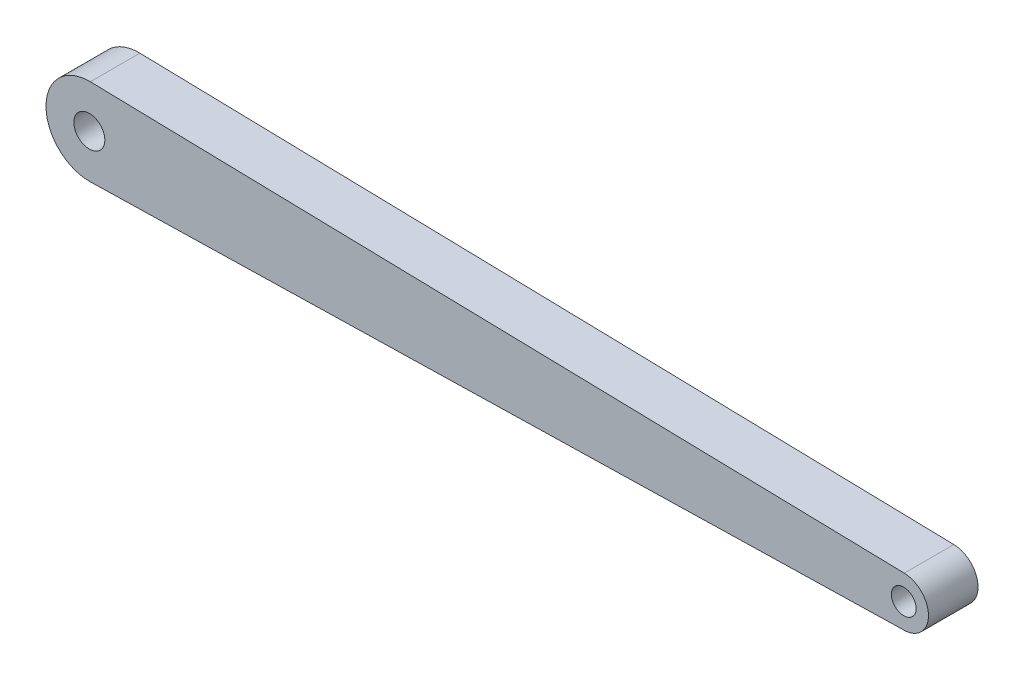
ISO-10303-21;
HEADER;
FILE_DESCRIPTION(('STEP AP214'),'2;1');
FILE_NAME('part.step','',(''),(''),'','','');
FILE_SCHEMA(('AUTOMOTIVE_DESIGN { 1 0 10303 214 1 1 1 1 }'));
ENDSEC;
DATA;
#1=APPLICATION_CONTEXT('core data for automotive mechanical design processes');
#2=APPLICATION_PROTOCOL_DEFINITION('international standard','automotive_design',2000,#1);
#3=PRODUCT_CONTEXT('',#1,'mechanical');
#4=PRODUCT('Part','Part','',(#3));
#5=PRODUCT_RELATED_PRODUCT_CATEGORY('part','',(#4));
#6=PRODUCT_DEFINITION_FORMATION('','',#4);
#7=PRODUCT_DEFINITION_CONTEXT('part definition',#1,'design');
#8=PRODUCT_DEFINITION('design','',#6,#7);
#9=PRODUCT_DEFINITION_SHAPE('','',#8);
#10=(LENGTH_UNIT() NAMED_UNIT(*) SI_UNIT(.MILLI.,.METRE.));
#11=(NAMED_UNIT(*) PLANE_ANGLE_UNIT() SI_UNIT($,.RADIAN.));
#12=(NAMED_UNIT(*) SI_UNIT($,.STERADIAN.) SOLID_ANGLE_UNIT());
#13=UNCERTAINTY_MEASURE_WITH_UNIT(LENGTH_MEASURE(1.E-05),#10,'distance_accuracy_value','');
#14=(GEOMETRIC_REPRESENTATION_CONTEXT(3) GLOBAL_UNCERTAINTY_ASSIGNED_CONTEXT((#13)) GLOBAL_UNIT_ASSIGNED_CONTEXT((#10,
#11,#12)) REPRESENTATION_CONTEXT('',''));
#15=CARTESIAN_POINT('',(0.,0.,0.));
#16=DIRECTION('',(0.,0.,1.));
#17=DIRECTION('',(1.,0.,0.));
#18=AXIS2_PLACEMENT_3D('',#15,#16,#17);
#19=CARTESIAN_POINT('',(-1315.,0.,40.));
#20=DIRECTION('',(0.,0.,1.));
#21=DIRECTION('',(1.,0.,0.));
#22=AXIS2_PLACEMENT_3D('',#19,#20,#21);
#23=PLANE('',#22);
#24=CARTESIAN_POINT('',(0.,0.,40.));
#25=DIRECTION('',(0.,0.,1.));
#26=DIRECTION('',(1.,0.,0.));
#27=AXIS2_PLACEMENT_3D('',#24,#25,#26);
#28=CIRCLE('',#27,20.);
#29=CARTESIAN_POINT('',(20.,0.,40.));
#30=VERTEX_POINT('',#29);
#31=EDGE_CURVE('E112',#30,#30,#28,.T.);
#32=ORIENTED_EDGE('',*,*,#31,.F.);
#33=EDGE_LOOP('',(#32));
#34=FACE_BOUND('',#33,.T.);
#35=CARTESIAN_POINT('',(-1315.,0.,40.));
#36=DIRECTION('',(0.,0.,1.));
#37=DIRECTION('',(1.,0.,0.));
#38=AXIS2_PLACEMENT_3D('',#35,#36,#37);
#39=CIRCLE('',#38,70.);
#40=CARTESIAN_POINT('',(-1313.40304182509,69.9817813762097,40.));
#41=VERTEX_POINT('',#40);
#42=CARTESIAN_POINT('',(-1313.40304182509,-69.9817813762097,40.));
#43=VERTEX_POINT('',#42);
#44=EDGE_CURVE('E92',#41,#43,#39,.T.);
#45=ORIENTED_EDGE('',*,*,#44,.T.);
#46=DIRECTION('',(0.999739733945852,0.0228136882129278,0.));
#47=VECTOR('',#46,1.);
#48=CARTESIAN_POINT('',(-1313.40304182509,-69.9817813762097,40.));
#49=LINE('',#48,#47);
#50=CARTESIAN_POINT('',(0.912547528517138,-39.9895893578341,40.));
#51=VERTEX_POINT('',#50);
#52=EDGE_CURVE('E87',#43,#51,#49,.T.);
#53=ORIENTED_EDGE('',*,*,#52,.T.);
#54=CARTESIAN_POINT('',(0.,0.,40.));
#55=DIRECTION('',(0.,0.,1.));
#56=DIRECTION('',(-1.,0.,0.));
#57=AXIS2_PLACEMENT_3D('',#54,#55,#56);
#58=CIRCLE('',#57,40.);
#59=CARTESIAN_POINT('',(0.912547528517111,39.9895893578341,40.));
#60=VERTEX_POINT('',#59);
#61=EDGE_CURVE('E90',#51,#60,#58,.T.);
#62=ORIENTED_EDGE('',*,*,#61,.T.);
#63=DIRECTION('',(-0.999739733945852,0.0228136882129278,0.));
#64=VECTOR('',#63,1.);
#65=CARTESIAN_POINT('',(-1313.40304182509,69.9817813762097,40.));
#66=LINE('',#65,#64);
#67=EDGE_CURVE('E57',#60,#41,#66,.T.);
#68=ORIENTED_EDGE('',*,*,#67,.T.);
#69=EDGE_LOOP('',(#45,#53,#62,#68));
#70=FACE_BOUND('',#69,.T.);
#71=CARTESIAN_POINT('',(-1315.,0.,40.));
#72=DIRECTION('',(0.,0.,1.));
#73=DIRECTION('',(1.,0.,0.));
#74=AXIS2_PLACEMENT_3D('',#71,#72,#73);
#75=CIRCLE('',#74,25.);
#76=CARTESIAN_POINT('',(-1290.,0.,40.));
#77=VERTEX_POINT('',#76);
#78=EDGE_CURVE('E134',#77,#77,#75,.T.);
#79=ORIENTED_EDGE('',*,*,#78,.F.);
#80=EDGE_LOOP('',(#79));
#81=FACE_BOUND('',#80,.T.);
#82=ADVANCED_FACE('F39',(#34,#70,#81),#23,.T.);
#83=CARTESIAN_POINT('',(-1315.,0.,-40.));
#84=DIRECTION('',(0.,0.,1.));
#85=DIRECTION('',(1.,0.,0.));
#86=AXIS2_PLACEMENT_3D('',#83,#84,#85);
#87=PLANE('',#86);
#88=CARTESIAN_POINT('',(-1315.,0.,-40.));
#89=DIRECTION('',(0.,0.,1.));
#90=DIRECTION('',(1.,0.,0.));
#91=AXIS2_PLACEMENT_3D('',#88,#89,#90);
#92=CIRCLE('',#91,70.);
#93=CARTESIAN_POINT('',(-1313.40304182509,69.9817813762097,-40.));
#94=VERTEX_POINT('',#93);
#95=CARTESIAN_POINT('',(-1313.40304182509,-69.9817813762097,-40.));
#96=VERTEX_POINT('',#95);
#97=EDGE_CURVE('E108',#94,#96,#92,.T.);
#98=ORIENTED_EDGE('',*,*,#97,.F.);
#99=DIRECTION('',(-0.999739733945852,0.0228136882129278,0.));
#100=VECTOR('',#99,1.);
#101=CARTESIAN_POINT('',(-1313.40304182509,69.9817813762097,-40.));
#102=LINE('',#101,#100);
#103=CARTESIAN_POINT('',(0.912547528517111,39.9895893578341,-40.));
#104=VERTEX_POINT('',#103);
#105=EDGE_CURVE('E80',#104,#94,#102,.T.);
#106=ORIENTED_EDGE('',*,*,#105,.F.);
#107=CARTESIAN_POINT('',(0.,0.,-40.));
#108=DIRECTION('',(0.,0.,1.));
#109=DIRECTION('',(-1.,0.,0.));
#110=AXIS2_PLACEMENT_3D('',#107,#108,#109);
#111=CIRCLE('',#110,40.);
#112=CARTESIAN_POINT('',(0.912547528517138,-39.9895893578341,-40.));
#113=VERTEX_POINT('',#112);
#114=EDGE_CURVE('E74',#113,#104,#111,.T.);
#115=ORIENTED_EDGE('',*,*,#114,.F.);
#116=DIRECTION('',(0.999739733945852,0.0228136882129278,0.));
#117=VECTOR('',#116,1.);
#118=CARTESIAN_POINT('',(-1313.40304182509,-69.9817813762097,-40.));
#119=LINE('',#118,#117);
#120=EDGE_CURVE('E97',#96,#113,#119,.T.);
#121=ORIENTED_EDGE('',*,*,#120,.F.);
#122=EDGE_LOOP('',(#98,#106,#115,#121));
#123=FACE_BOUND('',#122,.T.);
#124=CARTESIAN_POINT('',(0.,0.,-40.));
#125=DIRECTION('',(0.,0.,1.));
#126=DIRECTION('',(1.,0.,0.));
#127=AXIS2_PLACEMENT_3D('',#124,#125,#126);
#128=CIRCLE('',#127,20.);
#129=CARTESIAN_POINT('',(20.,0.,-40.));
#130=VERTEX_POINT('',#129);
#131=EDGE_CURVE('E130',#130,#130,#128,.T.);
#132=ORIENTED_EDGE('',*,*,#131,.T.);
#133=EDGE_LOOP('',(#132));
#134=FACE_BOUND('',#133,.T.);
#135=CARTESIAN_POINT('',(-1315.,0.,-40.));
#136=DIRECTION('',(0.,0.,1.));
#137=DIRECTION('',(1.,0.,0.));
#138=AXIS2_PLACEMENT_3D('',#135,#136,#137);
#139=CIRCLE('',#138,25.);
#140=CARTESIAN_POINT('',(-1290.,0.,-40.));
#141=VERTEX_POINT('',#140);
#142=EDGE_CURVE('E138',#141,#141,#139,.T.);
#143=ORIENTED_EDGE('',*,*,#142,.T.);
#144=EDGE_LOOP('',(#143));
#145=FACE_BOUND('',#144,.T.);
#146=ADVANCED_FACE('F125',(#123,#134,#145),#87,.F.);
#147=CARTESIAN_POINT('',(-1315.,0.,40.));
#148=DIRECTION('',(0.,0.,-1.));
#149=DIRECTION('',(-1.,0.,0.));
#150=AXIS2_PLACEMENT_3D('',#147,#148,#149);
#151=CYLINDRICAL_SURFACE('',#150,70.);
#152=ORIENTED_EDGE('',*,*,#97,.T.);
#153=DIRECTION('',(0.,0.,-1.));
#154=VECTOR('',#153,1.);
#155=CARTESIAN_POINT('',(-1313.40304182509,-69.9817813762097,40.));
#156=LINE('',#155,#154);
#157=EDGE_CURVE('E11',#43,#96,#156,.T.);
#158=ORIENTED_EDGE('',*,*,#157,.F.);
#159=ORIENTED_EDGE('',*,*,#44,.F.);
#160=DIRECTION('',(0.,0.,-1.));
#161=VECTOR('',#160,1.);
#162=CARTESIAN_POINT('',(-1313.40304182509,69.9817813762097,40.));
#163=LINE('',#162,#161);
#164=EDGE_CURVE('E104',#41,#94,#163,.T.);
#165=ORIENTED_EDGE('',*,*,#164,.T.);
#166=EDGE_LOOP('',(#152,#158,#159,#165));
#167=FACE_BOUND('',#166,.T.);
#168=ADVANCED_FACE('F41',(#167),#151,.T.);
#169=CARTESIAN_POINT('',(-1313.40304182509,-69.9817813762097,40.));
#170=DIRECTION('',(-0.0228136882129278,0.999739733945852,0.));
#171=DIRECTION('',(-0.999739733945852,-0.0228136882129278,0.));
#172=AXIS2_PLACEMENT_3D('',#169,#170,#171);
#173=PLANE('',#172);
#174=ORIENTED_EDGE('',*,*,#120,.T.);
#175=DIRECTION('',(0.,0.,-1.));
#176=VECTOR('',#175,1.);
#177=CARTESIAN_POINT('',(0.912547528517138,-39.9895893578341,40.));
#178=LINE('',#177,#176);
#179=EDGE_CURVE('E49',#51,#113,#178,.T.);
#180=ORIENTED_EDGE('',*,*,#179,.F.);
#181=ORIENTED_EDGE('',*,*,#52,.F.);
#182=ORIENTED_EDGE('',*,*,#157,.T.);
#183=EDGE_LOOP('',(#174,#180,#181,#182));
#184=FACE_BOUND('',#183,.T.);
#185=ADVANCED_FACE('F96',(#184),#173,.F.);
#186=CARTESIAN_POINT('',(0.,0.,40.));
#187=DIRECTION('',(0.,0.,-1.));
#188=DIRECTION('',(-1.,0.,0.));
#189=AXIS2_PLACEMENT_3D('',#186,#187,#188);
#190=CYLINDRICAL_SURFACE('',#189,40.);
#191=ORIENTED_EDGE('',*,*,#114,.T.);
#192=DIRECTION('',(0.,0.,-1.));
#193=VECTOR('',#192,1.);
#194=CARTESIAN_POINT('',(0.912547528517111,39.9895893578341,40.));
#195=LINE('',#194,#193);
#196=EDGE_CURVE('E99',#60,#104,#195,.T.);
#197=ORIENTED_EDGE('',*,*,#196,.F.);
#198=ORIENTED_EDGE('',*,*,#61,.F.);
#199=ORIENTED_EDGE('',*,*,#179,.T.);
#200=EDGE_LOOP('',(#191,#197,#198,#199));
#201=FACE_BOUND('',#200,.T.);
#202=ADVANCED_FACE('F100',(#201),#190,.T.);
#203=CARTESIAN_POINT('',(-1313.40304182509,69.9817813762097,40.));
#204=DIRECTION('',(-0.0228136882129278,-0.999739733945852,0.));
#205=DIRECTION('',(0.999739733945852,-0.0228136882129278,0.));
#206=AXIS2_PLACEMENT_3D('',#203,#204,#205);
#207=PLANE('',#206);
#208=ORIENTED_EDGE('',*,*,#105,.T.);
#209=ORIENTED_EDGE('',*,*,#164,.F.);
#210=ORIENTED_EDGE('',*,*,#67,.F.);
#211=ORIENTED_EDGE('',*,*,#196,.T.);
#212=EDGE_LOOP('',(#208,#209,#210,#211));
#213=FACE_BOUND('',#212,.T.);
#214=ADVANCED_FACE('F122',(#213),#207,.F.);
#215=CARTESIAN_POINT('',(0.,0.,40.));
#216=DIRECTION('',(0.,0.,-1.));
#217=DIRECTION('',(-1.,0.,0.));
#218=AXIS2_PLACEMENT_3D('',#215,#216,#217);
#219=CYLINDRICAL_SURFACE('',#218,20.);
#220=ORIENTED_EDGE('',*,*,#31,.T.);
#221=EDGE_LOOP('',(#220));
#222=FACE_BOUND('',#221,.T.);
#223=ORIENTED_EDGE('',*,*,#131,.F.);
#224=EDGE_LOOP('',(#223));
#225=FACE_BOUND('',#224,.T.);
#226=ADVANCED_FACE('F157',(#222,#225),#219,.F.);
#227=CARTESIAN_POINT('',(-1315.,0.,40.));
#228=DIRECTION('',(0.,0.,-1.));
#229=DIRECTION('',(-1.,0.,0.));
#230=AXIS2_PLACEMENT_3D('',#227,#228,#229);
#231=CYLINDRICAL_SURFACE('',#230,25.);
#232=ORIENTED_EDGE('',*,*,#78,.T.);
#233=EDGE_LOOP('',(#232));
#234=FACE_BOUND('',#233,.T.);
#235=ORIENTED_EDGE('',*,*,#142,.F.);
#236=EDGE_LOOP('',(#235));
#237=FACE_BOUND('',#236,.T.);
#238=ADVANCED_FACE('F146',(#234,#237),#231,.F.);
#239=CLOSED_SHELL('',(#82,#146,#168,#185,#202,#214,#226,#238));
#240=MANIFOLD_SOLID_BREP('B2',#239);
#241=ADVANCED_BREP_SHAPE_REPRESENTATION('',(#18,#240),#14);
#242=SHAPE_DEFINITION_REPRESENTATION(#9,#241);
ENDSEC;
END-ISO-10303-21;
